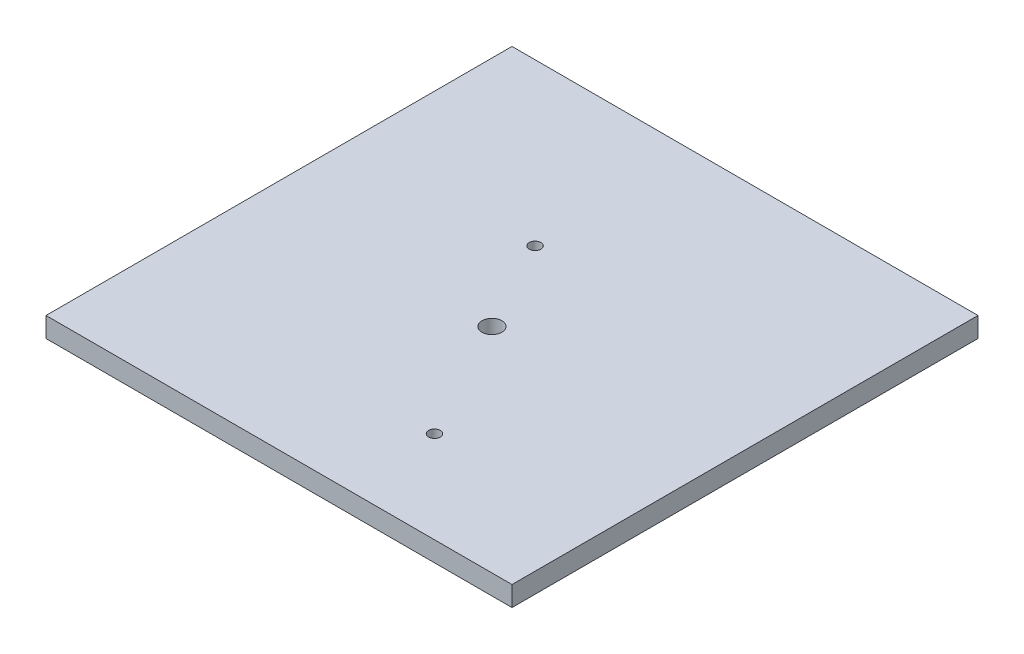
ISO-10303-21;
HEADER;
FILE_DESCRIPTION(('STEP AP214'),'2;1');
FILE_NAME('part.step','',(''),(''),'','','');
FILE_SCHEMA(('AUTOMOTIVE_DESIGN { 1 0 10303 214 1 1 1 1 }'));
ENDSEC;
DATA;
#1=APPLICATION_CONTEXT('core data for automotive mechanical design processes');
#2=APPLICATION_PROTOCOL_DEFINITION('international standard','automotive_design',2000,#1);
#3=PRODUCT_CONTEXT('',#1,'mechanical');
#4=PRODUCT('Part','Part','',(#3));
#5=PRODUCT_RELATED_PRODUCT_CATEGORY('part','',(#4));
#6=PRODUCT_DEFINITION_FORMATION('','',#4);
#7=PRODUCT_DEFINITION_CONTEXT('part definition',#1,'design');
#8=PRODUCT_DEFINITION('design','',#6,#7);
#9=PRODUCT_DEFINITION_SHAPE('','',#8);
#10=(LENGTH_UNIT() NAMED_UNIT(*) SI_UNIT(.MILLI.,.METRE.));
#11=(NAMED_UNIT(*) PLANE_ANGLE_UNIT() SI_UNIT($,.RADIAN.));
#12=(NAMED_UNIT(*) SI_UNIT($,.STERADIAN.) SOLID_ANGLE_UNIT());
#13=UNCERTAINTY_MEASURE_WITH_UNIT(LENGTH_MEASURE(1.E-05),#10,'distance_accuracy_value','');
#14=(GEOMETRIC_REPRESENTATION_CONTEXT(3) GLOBAL_UNCERTAINTY_ASSIGNED_CONTEXT((#13)) GLOBAL_UNIT_ASSIGNED_CONTEXT((#10,
#11,#12)) REPRESENTATION_CONTEXT('',''));
#15=CARTESIAN_POINT('',(0.,0.,0.));
#16=DIRECTION('',(0.,0.,1.));
#17=DIRECTION('',(1.,0.,0.));
#18=AXIS2_PLACEMENT_3D('',#15,#16,#17);
#19=CARTESIAN_POINT('',(-70.,6.,70.));
#20=DIRECTION('',(1.,0.,0.));
#21=DIRECTION('',(0.,0.,-1.));
#22=AXIS2_PLACEMENT_3D('',#19,#20,#21);
#23=PLANE('',#22);
#24=DIRECTION('',(0.,0.,1.));
#25=VECTOR('',#24,1.);
#26=CARTESIAN_POINT('',(-70.,0.,70.));
#27=LINE('',#26,#25);
#28=CARTESIAN_POINT('',(-70.,0.,-70.));
#29=VERTEX_POINT('',#28);
#30=CARTESIAN_POINT('',(-70.,0.,70.));
#31=VERTEX_POINT('',#30);
#32=EDGE_CURVE('E114',#29,#31,#27,.T.);
#33=ORIENTED_EDGE('',*,*,#32,.T.);
#34=DIRECTION('',(0.,-1.,0.));
#35=VECTOR('',#34,1.);
#36=CARTESIAN_POINT('',(-70.,6.,70.));
#37=LINE('',#36,#35);
#38=CARTESIAN_POINT('',(-70.,6.,70.));
#39=VERTEX_POINT('',#38);
#40=EDGE_CURVE('E11',#39,#31,#37,.T.);
#41=ORIENTED_EDGE('',*,*,#40,.F.);
#42=DIRECTION('',(0.,0.,1.));
#43=VECTOR('',#42,1.);
#44=CARTESIAN_POINT('',(-70.,6.,70.));
#45=LINE('',#44,#43);
#46=CARTESIAN_POINT('',(-70.,6.,-70.));
#47=VERTEX_POINT('',#46);
#48=EDGE_CURVE('E100',#47,#39,#45,.T.);
#49=ORIENTED_EDGE('',*,*,#48,.F.);
#50=DIRECTION('',(0.,-1.,0.));
#51=VECTOR('',#50,1.);
#52=CARTESIAN_POINT('',(-70.,6.,-70.));
#53=LINE('',#52,#51);
#54=EDGE_CURVE('E108',#47,#29,#53,.T.);
#55=ORIENTED_EDGE('',*,*,#54,.T.);
#56=EDGE_LOOP('',(#33,#41,#49,#55));
#57=FACE_BOUND('',#56,.T.);
#58=ADVANCED_FACE('F44',(#57),#23,.F.);
#59=CARTESIAN_POINT('',(-70.,6.,70.));
#60=DIRECTION('',(0.,0.,-1.));
#61=DIRECTION('',(-1.,0.,0.));
#62=AXIS2_PLACEMENT_3D('',#59,#60,#61);
#63=PLANE('',#62);
#64=DIRECTION('',(1.,0.,0.));
#65=VECTOR('',#64,1.);
#66=CARTESIAN_POINT('',(-70.,0.,70.));
#67=LINE('',#66,#65);
#68=CARTESIAN_POINT('',(70.,0.,70.));
#69=VERTEX_POINT('',#68);
#70=EDGE_CURVE('E105',#31,#69,#67,.T.);
#71=ORIENTED_EDGE('',*,*,#70,.T.);
#72=DIRECTION('',(0.,-1.,0.));
#73=VECTOR('',#72,1.);
#74=CARTESIAN_POINT('',(70.,6.,70.));
#75=LINE('',#74,#73);
#76=CARTESIAN_POINT('',(70.,6.,70.));
#77=VERTEX_POINT('',#76);
#78=EDGE_CURVE('E53',#77,#69,#75,.T.);
#79=ORIENTED_EDGE('',*,*,#78,.F.);
#80=DIRECTION('',(1.,0.,0.));
#81=VECTOR('',#80,1.);
#82=CARTESIAN_POINT('',(-70.,6.,70.));
#83=LINE('',#82,#81);
#84=EDGE_CURVE('E95',#39,#77,#83,.T.);
#85=ORIENTED_EDGE('',*,*,#84,.F.);
#86=ORIENTED_EDGE('',*,*,#40,.T.);
#87=EDGE_LOOP('',(#71,#79,#85,#86));
#88=FACE_BOUND('',#87,.T.);
#89=ADVANCED_FACE('F101',(#88),#63,.F.);
#90=CARTESIAN_POINT('',(70.,6.,70.));
#91=DIRECTION('',(-1.,0.,0.));
#92=DIRECTION('',(0.,0.,1.));
#93=AXIS2_PLACEMENT_3D('',#90,#91,#92);
#94=PLANE('',#93);
#95=DIRECTION('',(0.,0.,-1.));
#96=VECTOR('',#95,1.);
#97=CARTESIAN_POINT('',(70.,0.,70.));
#98=LINE('',#97,#96);
#99=CARTESIAN_POINT('',(70.,0.,-70.));
#100=VERTEX_POINT('',#99);
#101=EDGE_CURVE('E76',#69,#100,#98,.T.);
#102=ORIENTED_EDGE('',*,*,#101,.T.);
#103=DIRECTION('',(0.,-1.,0.));
#104=VECTOR('',#103,1.);
#105=CARTESIAN_POINT('',(70.,6.,-70.));
#106=LINE('',#105,#104);
#107=CARTESIAN_POINT('',(70.,6.,-70.));
#108=VERTEX_POINT('',#107);
#109=EDGE_CURVE('E102',#108,#100,#106,.T.);
#110=ORIENTED_EDGE('',*,*,#109,.F.);
#111=DIRECTION('',(0.,0.,-1.));
#112=VECTOR('',#111,1.);
#113=CARTESIAN_POINT('',(70.,6.,70.));
#114=LINE('',#113,#112);
#115=EDGE_CURVE('E92',#77,#108,#114,.T.);
#116=ORIENTED_EDGE('',*,*,#115,.F.);
#117=ORIENTED_EDGE('',*,*,#78,.T.);
#118=EDGE_LOOP('',(#102,#110,#116,#117));
#119=FACE_BOUND('',#118,.T.);
#120=ADVANCED_FACE('F104',(#119),#94,.F.);
#121=CARTESIAN_POINT('',(-70.,6.,-70.));
#122=DIRECTION('',(0.,0.,1.));
#123=DIRECTION('',(1.,0.,0.));
#124=AXIS2_PLACEMENT_3D('',#121,#122,#123);
#125=PLANE('',#124);
#126=DIRECTION('',(-1.,0.,0.));
#127=VECTOR('',#126,1.);
#128=CARTESIAN_POINT('',(-70.,0.,-70.));
#129=LINE('',#128,#127);
#130=EDGE_CURVE('E81',#100,#29,#129,.T.);
#131=ORIENTED_EDGE('',*,*,#130,.T.);
#132=ORIENTED_EDGE('',*,*,#54,.F.);
#133=DIRECTION('',(-1.,0.,0.));
#134=VECTOR('',#133,1.);
#135=CARTESIAN_POINT('',(-70.,6.,-70.));
#136=LINE('',#135,#134);
#137=EDGE_CURVE('E65',#108,#47,#136,.T.);
#138=ORIENTED_EDGE('',*,*,#137,.F.);
#139=ORIENTED_EDGE('',*,*,#109,.T.);
#140=EDGE_LOOP('',(#131,#132,#138,#139));
#141=FACE_BOUND('',#140,.T.);
#142=ADVANCED_FACE('F130',(#141),#125,.F.);
#143=CARTESIAN_POINT('',(0.,6.,0.));
#144=DIRECTION('',(0.,-1.,0.));
#145=DIRECTION('',(0.,0.,-1.));
#146=AXIS2_PLACEMENT_3D('',#143,#144,#145);
#147=PLANE('',#146);
#148=CARTESIAN_POINT('',(19.1225021008563,6.,42.4139226361149));
#149=DIRECTION('',(0.,-1.,0.));
#150=DIRECTION('',(0.,0.,-1.));
#151=AXIS2_PLACEMENT_3D('',#148,#149,#150);
#152=CIRCLE('',#151,1.75);
#153=CARTESIAN_POINT('',(19.1225021008563,6.,40.6639226361149));
#154=VERTEX_POINT('',#153);
#155=EDGE_CURVE('E148',#154,#154,#152,.T.);
#156=ORIENTED_EDGE('',*,*,#155,.T.);
#157=EDGE_LOOP('',(#156));
#158=FACE_BOUND('',#157,.T.);
#159=CARTESIAN_POINT('',(-14.6446824199415,6.,-21.5770886672999));
#160=DIRECTION('',(0.,1.,0.));
#161=DIRECTION('',(0.,0.,1.));
#162=AXIS2_PLACEMENT_3D('',#159,#160,#161);
#163=CIRCLE('',#162,1.75);
#164=CARTESIAN_POINT('',(-14.6446824199415,6.,-19.8270886672999));
#165=VERTEX_POINT('',#164);
#166=EDGE_CURVE('E142',#165,#165,#163,.T.);
#167=ORIENTED_EDGE('',*,*,#166,.F.);
#168=EDGE_LOOP('',(#167));
#169=FACE_BOUND('',#168,.T.);
#170=CARTESIAN_POINT('',(-0.153405186608779,6.,5.88482438223537));
#171=DIRECTION('',(0.,-1.,0.));
#172=DIRECTION('',(0.,0.,-1.));
#173=AXIS2_PLACEMENT_3D('',#170,#171,#172);
#174=CIRCLE('',#173,3.);
#175=CARTESIAN_POINT('',(-0.153405186608779,6.,2.88482438223537));
#176=VERTEX_POINT('',#175);
#177=EDGE_CURVE('E120',#176,#176,#174,.T.);
#178=ORIENTED_EDGE('',*,*,#177,.T.);
#179=EDGE_LOOP('',(#178));
#180=FACE_BOUND('',#179,.T.);
#181=ORIENTED_EDGE('',*,*,#48,.T.);
#182=ORIENTED_EDGE('',*,*,#84,.T.);
#183=ORIENTED_EDGE('',*,*,#115,.T.);
#184=ORIENTED_EDGE('',*,*,#137,.T.);
#185=EDGE_LOOP('',(#181,#182,#183,#184));
#186=FACE_BOUND('',#185,.T.);
#187=ADVANCED_FACE('F91',(#158,#169,#180,#186),#147,.F.);
#188=CARTESIAN_POINT('',(0.,0.,0.));
#189=DIRECTION('',(0.,-1.,0.));
#190=DIRECTION('',(0.,0.,-1.));
#191=AXIS2_PLACEMENT_3D('',#188,#189,#190);
#192=PLANE('',#191);
#193=CARTESIAN_POINT('',(19.1225021008563,0.,42.4139226361149));
#194=DIRECTION('',(0.,-1.,0.));
#195=DIRECTION('',(0.,0.,-1.));
#196=AXIS2_PLACEMENT_3D('',#193,#194,#195);
#197=CIRCLE('',#196,1.75);
#198=CARTESIAN_POINT('',(19.1225021008563,0.,40.6639226361149));
#199=VERTEX_POINT('',#198);
#200=EDGE_CURVE('E147',#199,#199,#197,.T.);
#201=ORIENTED_EDGE('',*,*,#200,.F.);
#202=EDGE_LOOP('',(#201));
#203=FACE_BOUND('',#202,.T.);
#204=CARTESIAN_POINT('',(-14.6446824199415,0.,-21.5770886672999));
#205=DIRECTION('',(0.,1.,0.));
#206=DIRECTION('',(0.,0.,1.));
#207=AXIS2_PLACEMENT_3D('',#204,#205,#206);
#208=CIRCLE('',#207,1.75);
#209=CARTESIAN_POINT('',(-14.6446824199415,0.,-19.8270886672999));
#210=VERTEX_POINT('',#209);
#211=EDGE_CURVE('E137',#210,#210,#208,.T.);
#212=ORIENTED_EDGE('',*,*,#211,.T.);
#213=EDGE_LOOP('',(#212));
#214=FACE_BOUND('',#213,.T.);
#215=CARTESIAN_POINT('',(-0.153405186608779,0.,5.88482438223537));
#216=DIRECTION('',(0.,-1.,0.));
#217=DIRECTION('',(0.,0.,-1.));
#218=AXIS2_PLACEMENT_3D('',#215,#216,#217);
#219=CIRCLE('',#218,3.);
#220=CARTESIAN_POINT('',(-0.153405186608779,0.,2.88482438223537));
#221=VERTEX_POINT('',#220);
#222=EDGE_CURVE('E131',#221,#221,#219,.T.);
#223=ORIENTED_EDGE('',*,*,#222,.F.);
#224=EDGE_LOOP('',(#223));
#225=FACE_BOUND('',#224,.T.);
#226=ORIENTED_EDGE('',*,*,#32,.F.);
#227=ORIENTED_EDGE('',*,*,#130,.F.);
#228=ORIENTED_EDGE('',*,*,#101,.F.);
#229=ORIENTED_EDGE('',*,*,#70,.F.);
#230=EDGE_LOOP('',(#226,#227,#228,#229));
#231=FACE_BOUND('',#230,.T.);
#232=ADVANCED_FACE('F128',(#203,#214,#225,#231),#192,.T.);
#233=CARTESIAN_POINT('',(-0.153405186608779,6.,5.88482438223537));
#234=DIRECTION('',(0.,-1.,0.));
#235=DIRECTION('',(0.,0.,-1.));
#236=AXIS2_PLACEMENT_3D('',#233,#234,#235);
#237=CYLINDRICAL_SURFACE('',#236,3.);
#238=ORIENTED_EDGE('',*,*,#177,.F.);
#239=EDGE_LOOP('',(#238));
#240=FACE_BOUND('',#239,.T.);
#241=ORIENTED_EDGE('',*,*,#222,.T.);
#242=EDGE_LOOP('',(#241));
#243=FACE_BOUND('',#242,.T.);
#244=ADVANCED_FACE('F166',(#240,#243),#237,.F.);
#245=CARTESIAN_POINT('',(-14.6446824199415,0.,-21.5770886672999));
#246=DIRECTION('',(0.,1.,0.));
#247=DIRECTION('',(0.,0.,1.));
#248=AXIS2_PLACEMENT_3D('',#245,#246,#247);
#249=CYLINDRICAL_SURFACE('',#248,1.75);
#250=ORIENTED_EDGE('',*,*,#211,.F.);
#251=EDGE_LOOP('',(#250));
#252=FACE_BOUND('',#251,.T.);
#253=ORIENTED_EDGE('',*,*,#166,.T.);
#254=EDGE_LOOP('',(#253));
#255=FACE_BOUND('',#254,.T.);
#256=ADVANCED_FACE('F162',(#252,#255),#249,.F.);
#257=CARTESIAN_POINT('',(19.1225021008563,6.,42.4139226361149));
#258=DIRECTION('',(0.,-1.,0.));
#259=DIRECTION('',(0.,0.,-1.));
#260=AXIS2_PLACEMENT_3D('',#257,#258,#259);
#261=CYLINDRICAL_SURFACE('',#260,1.75);
#262=ORIENTED_EDGE('',*,*,#155,.F.);
#263=EDGE_LOOP('',(#262));
#264=FACE_BOUND('',#263,.T.);
#265=ORIENTED_EDGE('',*,*,#200,.T.);
#266=EDGE_LOOP('',(#265));
#267=FACE_BOUND('',#266,.T.);
#268=ADVANCED_FACE('F159',(#264,#267),#261,.F.);
#269=CLOSED_SHELL('',(#58,#89,#120,#142,#187,#232,#244,#256,#268));
#270=MANIFOLD_SOLID_BREP('B2',#269);
#271=ADVANCED_BREP_SHAPE_REPRESENTATION('',(#18,#270),#14);
#272=SHAPE_DEFINITION_REPRESENTATION(#9,#271);
ENDSEC;
END-ISO-10303-21;
